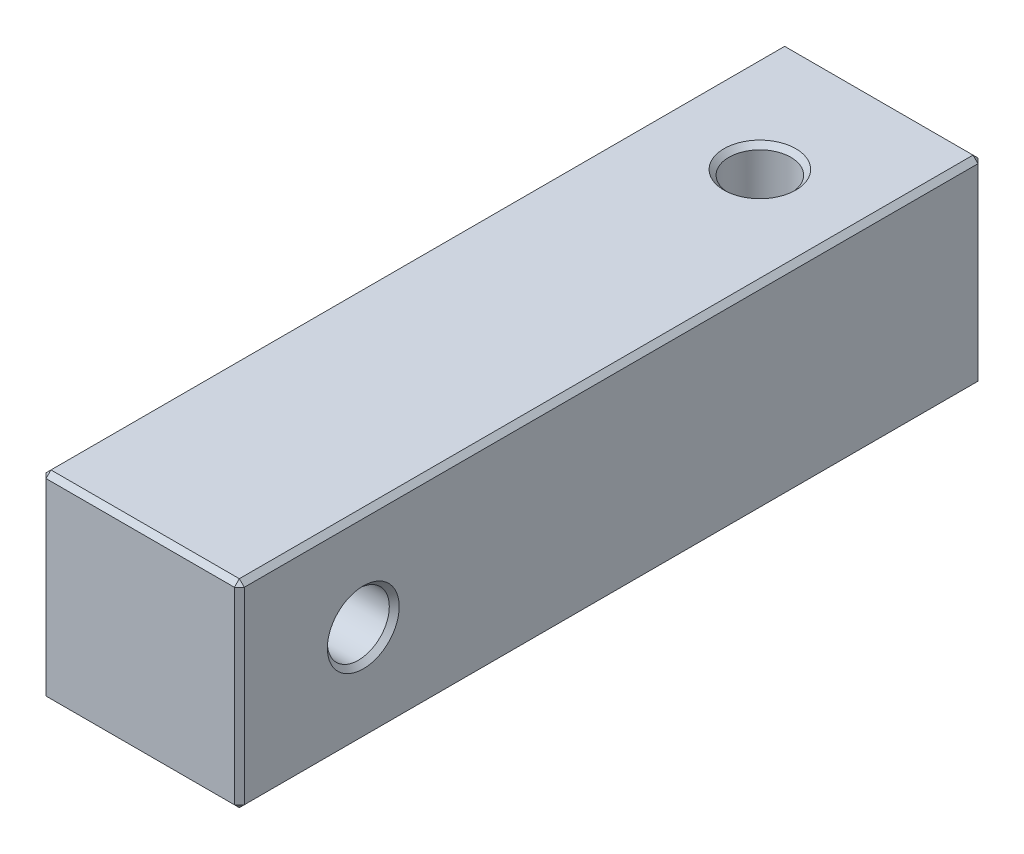
ISO-10303-21;
HEADER;
FILE_DESCRIPTION(('STEP AP214'),'2;1');
FILE_NAME('part.step','',(''),(''),'','','');
FILE_SCHEMA(('AUTOMOTIVE_DESIGN { 1 0 10303 214 1 1 1 1 }'));
ENDSEC;
DATA;
#1=APPLICATION_CONTEXT('core data for automotive mechanical design processes');
#2=APPLICATION_PROTOCOL_DEFINITION('international standard','automotive_design',2000,#1);
#3=PRODUCT_CONTEXT('',#1,'mechanical');
#4=PRODUCT('Part','Part','',(#3));
#5=PRODUCT_RELATED_PRODUCT_CATEGORY('part','',(#4));
#6=PRODUCT_DEFINITION_FORMATION('','',#4);
#7=PRODUCT_DEFINITION_CONTEXT('part definition',#1,'design');
#8=PRODUCT_DEFINITION('design','',#6,#7);
#9=PRODUCT_DEFINITION_SHAPE('','',#8);
#10=(LENGTH_UNIT() NAMED_UNIT(*) SI_UNIT(.MILLI.,.METRE.));
#11=(NAMED_UNIT(*) PLANE_ANGLE_UNIT() SI_UNIT($,.RADIAN.));
#12=(NAMED_UNIT(*) SI_UNIT($,.STERADIAN.) SOLID_ANGLE_UNIT());
#13=UNCERTAINTY_MEASURE_WITH_UNIT(LENGTH_MEASURE(1.E-05),#10,'distance_accuracy_value','');
#14=(GEOMETRIC_REPRESENTATION_CONTEXT(3) GLOBAL_UNCERTAINTY_ASSIGNED_CONTEXT((#13)) GLOBAL_UNIT_ASSIGNED_CONTEXT((#10,
#11,#12)) REPRESENTATION_CONTEXT('',''));
#15=CARTESIAN_POINT('',(0.,0.,0.));
#16=DIRECTION('',(0.,0.,1.));
#17=DIRECTION('',(1.,0.,0.));
#18=AXIS2_PLACEMENT_3D('',#15,#16,#17);
#19=CARTESIAN_POINT('',(4.,4.,15.));
#20=DIRECTION('',(-1.,0.,0.));
#21=DIRECTION('',(0.,-1.,0.));
#22=AXIS2_PLACEMENT_3D('',#19,#20,#21);
#23=PLANE('',#22);
#24=DIRECTION('',(0.,-1.,0.));
#25=VECTOR('',#24,1.);
#26=CARTESIAN_POINT('',(4.,-4.,14.8));
#27=LINE('',#26,#25);
#28=CARTESIAN_POINT('',(4.,3.8,14.8));
#29=VERTEX_POINT('',#28);
#30=CARTESIAN_POINT('',(4.,-3.8,14.8));
#31=VERTEX_POINT('',#30);
#32=EDGE_CURVE('E51',#29,#31,#27,.T.);
#33=ORIENTED_EDGE('',*,*,#32,.T.);
#34=DIRECTION('',(0.,0.,-1.));
#35=VECTOR('',#34,1.);
#36=CARTESIAN_POINT('',(4.,-3.8,15.));
#37=LINE('',#36,#35);
#38=CARTESIAN_POINT('',(4.,-3.8,-14.8));
#39=VERTEX_POINT('',#38);
#40=EDGE_CURVE('E11',#31,#39,#37,.T.);
#41=ORIENTED_EDGE('',*,*,#40,.T.);
#42=DIRECTION('',(0.,1.,0.));
#43=VECTOR('',#42,1.);
#44=CARTESIAN_POINT('',(4.,4.,-14.8));
#45=LINE('',#44,#43);
#46=CARTESIAN_POINT('',(4.,3.8,-14.8));
#47=VERTEX_POINT('',#46);
#48=EDGE_CURVE('E232',#39,#47,#45,.T.);
#49=ORIENTED_EDGE('',*,*,#48,.T.);
#50=DIRECTION('',(0.,0.,1.));
#51=VECTOR('',#50,1.);
#52=CARTESIAN_POINT('',(4.,3.8,15.));
#53=LINE('',#52,#51);
#54=EDGE_CURVE('E62',#47,#29,#53,.T.);
#55=ORIENTED_EDGE('',*,*,#54,.T.);
#56=EDGE_LOOP('',(#33,#41,#49,#55));
#57=FACE_BOUND('',#56,.T.);
#58=CARTESIAN_POINT('',(4.,0.,10.));
#59=DIRECTION('',(-1.,0.,0.));
#60=DIRECTION('',(0.,-1.,0.));
#61=AXIS2_PLACEMENT_3D('',#58,#59,#60);
#62=CIRCLE('',#61,1.45);
#63=CARTESIAN_POINT('',(4.,-1.45,10.));
#64=VERTEX_POINT('',#63);
#65=EDGE_CURVE('E229',#64,#64,#62,.T.);
#66=ORIENTED_EDGE('',*,*,#65,.T.);
#67=EDGE_LOOP('',(#66));
#68=FACE_BOUND('',#67,.T.);
#69=ADVANCED_FACE('F41',(#57,#68),#23,.F.);
#70=CARTESIAN_POINT('',(-4.,4.,15.));
#71=DIRECTION('',(0.,-1.,0.));
#72=DIRECTION('',(0.,0.,-1.));
#73=AXIS2_PLACEMENT_3D('',#70,#71,#72);
#74=PLANE('',#73);
#75=CARTESIAN_POINT('',(0.,4.,-10.));
#76=DIRECTION('',(0.,-1.,0.));
#77=DIRECTION('',(0.,0.,-1.));
#78=AXIS2_PLACEMENT_3D('',#75,#76,#77);
#79=CIRCLE('',#78,1.44999999999998);
#80=CARTESIAN_POINT('',(0.,4.,-11.45));
#81=VERTEX_POINT('',#80);
#82=EDGE_CURVE('E210',#81,#81,#79,.T.);
#83=ORIENTED_EDGE('',*,*,#82,.T.);
#84=EDGE_LOOP('',(#83));
#85=FACE_BOUND('',#84,.T.);
#86=DIRECTION('',(0.,0.,1.));
#87=VECTOR('',#86,1.);
#88=CARTESIAN_POINT('',(-3.8,4.,15.));
#89=LINE('',#88,#87);
#90=CARTESIAN_POINT('',(-3.8,4.,-14.8));
#91=VERTEX_POINT('',#90);
#92=CARTESIAN_POINT('',(-3.8,4.,14.8));
#93=VERTEX_POINT('',#92);
#94=EDGE_CURVE('E205',#91,#93,#89,.T.);
#95=ORIENTED_EDGE('',*,*,#94,.T.);
#96=DIRECTION('',(1.,0.,0.));
#97=VECTOR('',#96,1.);
#98=CARTESIAN_POINT('',(4.,4.,14.8));
#99=LINE('',#98,#97);
#100=CARTESIAN_POINT('',(3.8,4.,14.8));
#101=VERTEX_POINT('',#100);
#102=EDGE_CURVE('E207',#93,#101,#99,.T.);
#103=ORIENTED_EDGE('',*,*,#102,.T.);
#104=DIRECTION('',(0.,0.,-1.));
#105=VECTOR('',#104,1.);
#106=CARTESIAN_POINT('',(3.8,4.,15.));
#107=LINE('',#106,#105);
#108=CARTESIAN_POINT('',(3.8,4.,-14.8));
#109=VERTEX_POINT('',#108);
#110=EDGE_CURVE('E201',#101,#109,#107,.T.);
#111=ORIENTED_EDGE('',*,*,#110,.T.);
#112=DIRECTION('',(-1.,0.,0.));
#113=VECTOR('',#112,1.);
#114=CARTESIAN_POINT('',(-4.,4.,-14.8));
#115=LINE('',#114,#113);
#116=EDGE_CURVE('E203',#109,#91,#115,.T.);
#117=ORIENTED_EDGE('',*,*,#116,.T.);
#118=EDGE_LOOP('',(#95,#103,#111,#117));
#119=FACE_BOUND('',#118,.T.);
#120=ADVANCED_FACE('F332',(#85,#119),#74,.F.);
#121=CARTESIAN_POINT('',(-4.,4.,15.));
#122=DIRECTION('',(1.,0.,0.));
#123=DIRECTION('',(0.,1.,0.));
#124=AXIS2_PLACEMENT_3D('',#121,#122,#123);
#125=PLANE('',#124);
#126=CARTESIAN_POINT('',(-4.,0.,10.));
#127=DIRECTION('',(1.,0.,0.));
#128=DIRECTION('',(0.,1.,0.));
#129=AXIS2_PLACEMENT_3D('',#126,#127,#128);
#130=CIRCLE('',#129,1.45);
#131=CARTESIAN_POINT('',(-4.,1.45,10.));
#132=VERTEX_POINT('',#131);
#133=EDGE_CURVE('E192',#132,#132,#130,.T.);
#134=ORIENTED_EDGE('',*,*,#133,.T.);
#135=EDGE_LOOP('',(#134));
#136=FACE_BOUND('',#135,.T.);
#137=DIRECTION('',(0.,0.,1.));
#138=VECTOR('',#137,1.);
#139=CARTESIAN_POINT('',(-4.,-3.8,15.));
#140=LINE('',#139,#138);
#141=CARTESIAN_POINT('',(-4.,-3.8,-14.8));
#142=VERTEX_POINT('',#141);
#143=CARTESIAN_POINT('',(-4.,-3.8,14.8));
#144=VERTEX_POINT('',#143);
#145=EDGE_CURVE('E187',#142,#144,#140,.T.);
#146=ORIENTED_EDGE('',*,*,#145,.T.);
#147=DIRECTION('',(0.,1.,0.));
#148=VECTOR('',#147,1.);
#149=CARTESIAN_POINT('',(-4.,4.,14.8));
#150=LINE('',#149,#148);
#151=CARTESIAN_POINT('',(-4.,3.8,14.8));
#152=VERTEX_POINT('',#151);
#153=EDGE_CURVE('E189',#144,#152,#150,.T.);
#154=ORIENTED_EDGE('',*,*,#153,.T.);
#155=DIRECTION('',(0.,0.,-1.));
#156=VECTOR('',#155,1.);
#157=CARTESIAN_POINT('',(-4.,3.8,15.));
#158=LINE('',#157,#156);
#159=CARTESIAN_POINT('',(-4.,3.8,-14.8));
#160=VERTEX_POINT('',#159);
#161=EDGE_CURVE('E183',#152,#160,#158,.T.);
#162=ORIENTED_EDGE('',*,*,#161,.T.);
#163=DIRECTION('',(0.,-1.,0.));
#164=VECTOR('',#163,1.);
#165=CARTESIAN_POINT('',(-4.,4.,-14.8));
#166=LINE('',#165,#164);
#167=EDGE_CURVE('E185',#160,#142,#166,.T.);
#168=ORIENTED_EDGE('',*,*,#167,.T.);
#169=EDGE_LOOP('',(#146,#154,#162,#168));
#170=FACE_BOUND('',#169,.T.);
#171=ADVANCED_FACE('F360',(#136,#170),#125,.F.);
#172=CARTESIAN_POINT('',(-4.,-4.,15.));
#173=DIRECTION('',(0.,1.,0.));
#174=DIRECTION('',(0.,0.,1.));
#175=AXIS2_PLACEMENT_3D('',#172,#173,#174);
#176=PLANE('',#175);
#177=CARTESIAN_POINT('',(0.,-4.,-10.));
#178=DIRECTION('',(0.,1.,0.));
#179=DIRECTION('',(0.,0.,1.));
#180=AXIS2_PLACEMENT_3D('',#177,#178,#179);
#181=CIRCLE('',#180,1.45);
#182=CARTESIAN_POINT('',(0.,-4.,-8.55));
#183=VERTEX_POINT('',#182);
#184=EDGE_CURVE('E174',#183,#183,#181,.T.);
#185=ORIENTED_EDGE('',*,*,#184,.T.);
#186=EDGE_LOOP('',(#185));
#187=FACE_BOUND('',#186,.T.);
#188=DIRECTION('',(-1.,0.,0.));
#189=VECTOR('',#188,1.);
#190=CARTESIAN_POINT('',(-4.,-4.,14.8));
#191=LINE('',#190,#189);
#192=CARTESIAN_POINT('',(3.8,-4.,14.8));
#193=VERTEX_POINT('',#192);
#194=CARTESIAN_POINT('',(-3.8,-4.,14.8));
#195=VERTEX_POINT('',#194);
#196=EDGE_CURVE('E142',#193,#195,#191,.T.);
#197=ORIENTED_EDGE('',*,*,#196,.T.);
#198=DIRECTION('',(0.,0.,-1.));
#199=VECTOR('',#198,1.);
#200=CARTESIAN_POINT('',(-3.8,-4.,15.));
#201=LINE('',#200,#199);
#202=CARTESIAN_POINT('',(-3.8,-4.,-14.8));
#203=VERTEX_POINT('',#202);
#204=EDGE_CURVE('E138',#195,#203,#201,.T.);
#205=ORIENTED_EDGE('',*,*,#204,.T.);
#206=DIRECTION('',(1.,0.,0.));
#207=VECTOR('',#206,1.);
#208=CARTESIAN_POINT('',(-4.,-4.,-14.8));
#209=LINE('',#208,#207);
#210=CARTESIAN_POINT('',(3.8,-4.,-14.8));
#211=VERTEX_POINT('',#210);
#212=EDGE_CURVE('E130',#203,#211,#209,.T.);
#213=ORIENTED_EDGE('',*,*,#212,.T.);
#214=DIRECTION('',(0.,0.,1.));
#215=VECTOR('',#214,1.);
#216=CARTESIAN_POINT('',(3.8,-4.,15.));
#217=LINE('',#216,#215);
#218=EDGE_CURVE('E135',#211,#193,#217,.T.);
#219=ORIENTED_EDGE('',*,*,#218,.T.);
#220=EDGE_LOOP('',(#197,#205,#213,#219));
#221=FACE_BOUND('',#220,.T.);
#222=ADVANCED_FACE('F133',(#187,#221),#176,.F.);
#223=CARTESIAN_POINT('',(0.,0.,15.));
#224=DIRECTION('',(0.,0.,1.));
#225=DIRECTION('',(1.,0.,0.));
#226=AXIS2_PLACEMENT_3D('',#223,#224,#225);
#227=PLANE('',#226);
#228=DIRECTION('',(0.,-1.,0.));
#229=VECTOR('',#228,1.);
#230=CARTESIAN_POINT('',(-3.8,-4.,15.));
#231=LINE('',#230,#229);
#232=CARTESIAN_POINT('',(-3.8,3.8,15.));
#233=VERTEX_POINT('',#232);
#234=CARTESIAN_POINT('',(-3.8,-3.8,15.));
#235=VERTEX_POINT('',#234);
#236=EDGE_CURVE('E217',#233,#235,#231,.T.);
#237=ORIENTED_EDGE('',*,*,#236,.T.);
#238=DIRECTION('',(1.,0.,0.));
#239=VECTOR('',#238,1.);
#240=CARTESIAN_POINT('',(4.,-3.8,15.));
#241=LINE('',#240,#239);
#242=CARTESIAN_POINT('',(3.8,-3.8,15.));
#243=VERTEX_POINT('',#242);
#244=EDGE_CURVE('E219',#235,#243,#241,.T.);
#245=ORIENTED_EDGE('',*,*,#244,.T.);
#246=DIRECTION('',(0.,1.,0.));
#247=VECTOR('',#246,1.);
#248=CARTESIAN_POINT('',(3.8,4.,15.));
#249=LINE('',#248,#247);
#250=CARTESIAN_POINT('',(3.8,3.8,15.));
#251=VERTEX_POINT('',#250);
#252=EDGE_CURVE('E213',#243,#251,#249,.T.);
#253=ORIENTED_EDGE('',*,*,#252,.T.);
#254=DIRECTION('',(-1.,0.,0.));
#255=VECTOR('',#254,1.);
#256=CARTESIAN_POINT('',(-4.,3.8,15.));
#257=LINE('',#256,#255);
#258=EDGE_CURVE('E215',#251,#233,#257,.T.);
#259=ORIENTED_EDGE('',*,*,#258,.T.);
#260=EDGE_LOOP('',(#237,#245,#253,#259));
#261=FACE_BOUND('',#260,.T.);
#262=ADVANCED_FACE('F352',(#261),#227,.T.);
#263=CARTESIAN_POINT('',(0.,0.,-15.));
#264=DIRECTION('',(0.,0.,1.));
#265=DIRECTION('',(1.,0.,0.));
#266=AXIS2_PLACEMENT_3D('',#263,#264,#265);
#267=PLANE('',#266);
#268=DIRECTION('',(0.,-1.,0.));
#269=VECTOR('',#268,1.);
#270=CARTESIAN_POINT('',(3.8,0.,-15.));
#271=LINE('',#270,#269);
#272=CARTESIAN_POINT('',(3.8,3.8,-15.));
#273=VERTEX_POINT('',#272);
#274=CARTESIAN_POINT('',(3.8,-3.8,-15.));
#275=VERTEX_POINT('',#274);
#276=EDGE_CURVE('E222',#273,#275,#271,.T.);
#277=ORIENTED_EDGE('',*,*,#276,.T.);
#278=DIRECTION('',(-1.,0.,0.));
#279=VECTOR('',#278,1.);
#280=CARTESIAN_POINT('',(0.,-3.8,-15.));
#281=LINE('',#280,#279);
#282=CARTESIAN_POINT('',(-3.8,-3.8,-15.));
#283=VERTEX_POINT('',#282);
#284=EDGE_CURVE('E150',#275,#283,#281,.T.);
#285=ORIENTED_EDGE('',*,*,#284,.T.);
#286=DIRECTION('',(0.,1.,0.));
#287=VECTOR('',#286,1.);
#288=CARTESIAN_POINT('',(-3.8,0.,-15.));
#289=LINE('',#288,#287);
#290=CARTESIAN_POINT('',(-3.8,3.8,-15.));
#291=VERTEX_POINT('',#290);
#292=EDGE_CURVE('E226',#283,#291,#289,.T.);
#293=ORIENTED_EDGE('',*,*,#292,.T.);
#294=DIRECTION('',(1.,0.,0.));
#295=VECTOR('',#294,1.);
#296=CARTESIAN_POINT('',(0.,3.8,-15.));
#297=LINE('',#296,#295);
#298=EDGE_CURVE('E224',#291,#273,#297,.T.);
#299=ORIENTED_EDGE('',*,*,#298,.T.);
#300=EDGE_LOOP('',(#277,#285,#293,#299));
#301=FACE_BOUND('',#300,.T.);
#302=ADVANCED_FACE('F327',(#301),#267,.F.);
#303=CARTESIAN_POINT('',(4.,0.,10.));
#304=DIRECTION('',(1.,0.,0.));
#305=DIRECTION('',(0.,0.,-1.));
#306=AXIS2_PLACEMENT_3D('',#303,#304,#305);
#307=CYLINDRICAL_SURFACE('',#306,1.25);
#308=CARTESIAN_POINT('',(-3.79999999999999,0.,10.));
#309=DIRECTION('',(1.,0.,0.));
#310=DIRECTION('',(0.,0.,-1.));
#311=AXIS2_PLACEMENT_3D('',#308,#309,#310);
#312=CIRCLE('',#311,1.25);
#313=CARTESIAN_POINT('',(-3.79999999999999,0.,8.75));
#314=VERTEX_POINT('',#313);
#315=EDGE_CURVE('E198',#314,#314,#312,.F.);
#316=ORIENTED_EDGE('',*,*,#315,.T.);
#317=EDGE_LOOP('',(#316));
#318=FACE_BOUND('',#317,.T.);
#319=CARTESIAN_POINT('',(3.80000000000001,0.,10.));
#320=DIRECTION('',(-1.,0.,0.));
#321=DIRECTION('',(0.,0.,1.));
#322=AXIS2_PLACEMENT_3D('',#319,#320,#321);
#323=CIRCLE('',#322,1.25);
#324=CARTESIAN_POINT('',(3.80000000000001,0.,11.25));
#325=VERTEX_POINT('',#324);
#326=EDGE_CURVE('E195',#325,#325,#323,.F.);
#327=ORIENTED_EDGE('',*,*,#326,.T.);
#328=EDGE_LOOP('',(#327));
#329=FACE_BOUND('',#328,.T.);
#330=ADVANCED_FACE('F340',(#318,#329),#307,.F.);
#331=CARTESIAN_POINT('',(0.,4.,-10.));
#332=DIRECTION('',(0.,1.,0.));
#333=DIRECTION('',(0.,0.,1.));
#334=AXIS2_PLACEMENT_3D('',#331,#332,#333);
#335=CYLINDRICAL_SURFACE('',#334,1.24999999999999);
#336=CARTESIAN_POINT('',(0.,-3.79999999999999,-10.));
#337=DIRECTION('',(0.,1.,0.));
#338=DIRECTION('',(0.,0.,1.));
#339=AXIS2_PLACEMENT_3D('',#336,#337,#338);
#340=CIRCLE('',#339,1.24999999999999);
#341=CARTESIAN_POINT('',(0.,-3.79999999999999,-8.75000000000001));
#342=VERTEX_POINT('',#341);
#343=EDGE_CURVE('E180',#342,#342,#340,.F.);
#344=ORIENTED_EDGE('',*,*,#343,.T.);
#345=EDGE_LOOP('',(#344));
#346=FACE_BOUND('',#345,.T.);
#347=CARTESIAN_POINT('',(0.,3.80000000000001,-10.));
#348=DIRECTION('',(0.,-1.,0.));
#349=DIRECTION('',(0.,0.,-1.));
#350=AXIS2_PLACEMENT_3D('',#347,#348,#349);
#351=CIRCLE('',#350,1.24999999999999);
#352=CARTESIAN_POINT('',(0.,3.80000000000001,-11.25));
#353=VERTEX_POINT('',#352);
#354=EDGE_CURVE('E177',#353,#353,#351,.F.);
#355=ORIENTED_EDGE('',*,*,#354,.T.);
#356=EDGE_LOOP('',(#355));
#357=FACE_BOUND('',#356,.T.);
#358=ADVANCED_FACE('F342',(#346,#357),#335,.F.);
#359=CARTESIAN_POINT('',(0.,-4.,-10.));
#360=DIRECTION('',(0.,-1.,0.));
#361=DIRECTION('',(0.,0.,-1.));
#362=AXIS2_PLACEMENT_3D('',#359,#360,#361);
#363=CONICAL_SURFACE('',#362,1.45,0.785398163397445);
#364=ORIENTED_EDGE('',*,*,#343,.F.);
#365=EDGE_LOOP('',(#364));
#366=FACE_BOUND('',#365,.T.);
#367=ORIENTED_EDGE('',*,*,#184,.F.);
#368=EDGE_LOOP('',(#367));
#369=FACE_BOUND('',#368,.T.);
#370=ADVANCED_FACE('F349',(#366,#369),#363,.F.);
#371=CARTESIAN_POINT('',(-4.,0.,10.));
#372=DIRECTION('',(-1.,0.,0.));
#373=DIRECTION('',(0.,0.,1.));
#374=AXIS2_PLACEMENT_3D('',#371,#372,#373);
#375=CONICAL_SURFACE('',#374,1.45,0.78539816339745);
#376=ORIENTED_EDGE('',*,*,#315,.F.);
#377=EDGE_LOOP('',(#376));
#378=FACE_BOUND('',#377,.T.);
#379=ORIENTED_EDGE('',*,*,#133,.F.);
#380=EDGE_LOOP('',(#379));
#381=FACE_BOUND('',#380,.T.);
#382=ADVANCED_FACE('F374',(#378,#381),#375,.F.);
#383=CARTESIAN_POINT('',(0.,3.80000000000001,-10.));
#384=DIRECTION('',(0.,1.,0.));
#385=DIRECTION('',(0.,0.,1.));
#386=AXIS2_PLACEMENT_3D('',#383,#384,#385);
#387=CONICAL_SURFACE('',#386,1.24999999999999,0.785398163397449);
#388=ORIENTED_EDGE('',*,*,#82,.F.);
#389=EDGE_LOOP('',(#388));
#390=FACE_BOUND('',#389,.T.);
#391=ORIENTED_EDGE('',*,*,#354,.F.);
#392=EDGE_LOOP('',(#391));
#393=FACE_BOUND('',#392,.T.);
#394=ADVANCED_FACE('F381',(#390,#393),#387,.F.);
#395=CARTESIAN_POINT('',(-4.,4.,-14.8));
#396=DIRECTION('',(0.,-0.707106781186548,0.707106781186548));
#397=DIRECTION('',(-1.,0.,0.));
#398=AXIS2_PLACEMENT_3D('',#395,#396,#397);
#399=PLANE('',#398);
#400=DIRECTION('',(0.,0.707106781186547,0.707106781186547));
#401=VECTOR('',#400,1.);
#402=CARTESIAN_POINT('',(-3.8,3.8,-15.));
#403=LINE('',#402,#401);
#404=EDGE_CURVE('E46',#91,#291,#403,.F.);
#405=ORIENTED_EDGE('',*,*,#404,.F.);
#406=ORIENTED_EDGE('',*,*,#116,.F.);
#407=DIRECTION('',(0.,-0.707106781186547,-0.707106781186547));
#408=VECTOR('',#407,1.);
#409=CARTESIAN_POINT('',(3.8,3.8,-15.));
#410=LINE('',#409,#408);
#411=EDGE_CURVE('E170',#273,#109,#410,.F.);
#412=ORIENTED_EDGE('',*,*,#411,.F.);
#413=ORIENTED_EDGE('',*,*,#298,.F.);
#414=EDGE_LOOP('',(#405,#406,#412,#413));
#415=FACE_BOUND('',#414,.T.);
#416=ADVANCED_FACE('F388',(#415),#399,.F.);
#417=CARTESIAN_POINT('',(-3.8,3.8,-15.));
#418=DIRECTION('',(-0.577350269189626,0.577350269189626,-0.577350269189626));
#419=DIRECTION('',(-0.707106781186548,0.,0.707106781186548));
#420=AXIS2_PLACEMENT_3D('',#417,#418,#419);
#421=PLANE('',#420);
#422=DIRECTION('',(-0.707106781186547,-0.707106781186547,0.));
#423=VECTOR('',#422,1.);
#424=CARTESIAN_POINT('',(-3.9,3.9,-14.8));
#425=LINE('',#424,#423);
#426=EDGE_CURVE('E277',#91,#160,#425,.T.);
#427=ORIENTED_EDGE('',*,*,#426,.F.);
#428=ORIENTED_EDGE('',*,*,#404,.T.);
#429=DIRECTION('',(0.707106781186548,0.,-0.707106781186548));
#430=VECTOR('',#429,1.);
#431=CARTESIAN_POINT('',(-3.8,3.8,-15.));
#432=LINE('',#431,#430);
#433=EDGE_CURVE('E280',#160,#291,#432,.T.);
#434=ORIENTED_EDGE('',*,*,#433,.F.);
#435=EDGE_LOOP('',(#427,#428,#434));
#436=FACE_BOUND('',#435,.T.);
#437=ADVANCED_FACE('F489',(#436),#421,.T.);
#438=CARTESIAN_POINT('',(3.8,3.8,-15.));
#439=DIRECTION('',(0.577350269189626,0.577350269189626,-0.577350269189626));
#440=DIRECTION('',(-0.707106781186548,0.,-0.707106781186548));
#441=AXIS2_PLACEMENT_3D('',#438,#439,#440);
#442=PLANE('',#441);
#443=DIRECTION('',(0.707106781186548,0.,0.707106781186548));
#444=VECTOR('',#443,1.);
#445=CARTESIAN_POINT('',(3.8,3.8,-15.));
#446=LINE('',#445,#444);
#447=EDGE_CURVE('E271',#273,#47,#446,.T.);
#448=ORIENTED_EDGE('',*,*,#447,.F.);
#449=ORIENTED_EDGE('',*,*,#411,.T.);
#450=DIRECTION('',(-0.707106781186547,0.707106781186547,0.));
#451=VECTOR('',#450,1.);
#452=CARTESIAN_POINT('',(3.9,3.9,-14.8));
#453=LINE('',#452,#451);
#454=EDGE_CURVE('E274',#47,#109,#453,.T.);
#455=ORIENTED_EDGE('',*,*,#454,.F.);
#456=EDGE_LOOP('',(#448,#449,#455));
#457=FACE_BOUND('',#456,.T.);
#458=ADVANCED_FACE('F287',(#457),#442,.T.);
#459=CARTESIAN_POINT('',(-4.,4.,-14.8));
#460=DIRECTION('',(0.707106781186548,0.,0.707106781186548));
#461=DIRECTION('',(0.,-1.,0.));
#462=AXIS2_PLACEMENT_3D('',#459,#460,#461);
#463=PLANE('',#462);
#464=ORIENTED_EDGE('',*,*,#433,.T.);
#465=ORIENTED_EDGE('',*,*,#292,.F.);
#466=DIRECTION('',(-0.707106781186547,0.,0.707106781186547));
#467=VECTOR('',#466,1.);
#468=CARTESIAN_POINT('',(-3.8,-3.8,-15.));
#469=LINE('',#468,#467);
#470=EDGE_CURVE('E267',#142,#283,#469,.F.);
#471=ORIENTED_EDGE('',*,*,#470,.F.);
#472=ORIENTED_EDGE('',*,*,#167,.F.);
#473=EDGE_LOOP('',(#464,#465,#471,#472));
#474=FACE_BOUND('',#473,.T.);
#475=ADVANCED_FACE('F323',(#474),#463,.F.);
#476=CARTESIAN_POINT('',(-4.,3.8,15.));
#477=DIRECTION('',(0.707106781186548,-0.707106781186548,0.));
#478=DIRECTION('',(0.,0.,-1.));
#479=AXIS2_PLACEMENT_3D('',#476,#477,#478);
#480=PLANE('',#479);
#481=ORIENTED_EDGE('',*,*,#426,.T.);
#482=ORIENTED_EDGE('',*,*,#161,.F.);
#483=DIRECTION('',(0.707106781186547,0.707106781186547,0.));
#484=VECTOR('',#483,1.);
#485=CARTESIAN_POINT('',(-4.,3.8,14.8));
#486=LINE('',#485,#484);
#487=EDGE_CURVE('E264',#93,#152,#486,.F.);
#488=ORIENTED_EDGE('',*,*,#487,.F.);
#489=ORIENTED_EDGE('',*,*,#94,.F.);
#490=EDGE_LOOP('',(#481,#482,#488,#489));
#491=FACE_BOUND('',#490,.T.);
#492=ADVANCED_FACE('F471',(#491),#480,.F.);
#493=CARTESIAN_POINT('',(0.,3.8,15.));
#494=DIRECTION('',(0.,0.707106781186548,0.707106781186548));
#495=DIRECTION('',(1.,0.,0.));
#496=AXIS2_PLACEMENT_3D('',#493,#494,#495);
#497=PLANE('',#496);
#498=DIRECTION('',(0.,-0.707106781186547,0.707106781186547));
#499=VECTOR('',#498,1.);
#500=CARTESIAN_POINT('',(3.8,4.,14.8));
#501=LINE('',#500,#499);
#502=EDGE_CURVE('E258',#101,#251,#501,.T.);
#503=ORIENTED_EDGE('',*,*,#502,.F.);
#504=ORIENTED_EDGE('',*,*,#102,.F.);
#505=DIRECTION('',(0.,0.707106781186547,-0.707106781186547));
#506=VECTOR('',#505,1.);
#507=CARTESIAN_POINT('',(-3.8,3.9,14.9));
#508=LINE('',#507,#506);
#509=EDGE_CURVE('E261',#233,#93,#508,.T.);
#510=ORIENTED_EDGE('',*,*,#509,.F.);
#511=ORIENTED_EDGE('',*,*,#258,.F.);
#512=EDGE_LOOP('',(#503,#504,#510,#511));
#513=FACE_BOUND('',#512,.T.);
#514=ADVANCED_FACE('F465',(#513),#497,.T.);
#515=CARTESIAN_POINT('',(3.8,4.,15.));
#516=DIRECTION('',(-0.707106781186548,-0.707106781186548,0.));
#517=DIRECTION('',(0.,0.,-1.));
#518=AXIS2_PLACEMENT_3D('',#515,#516,#517);
#519=PLANE('',#518);
#520=ORIENTED_EDGE('',*,*,#454,.T.);
#521=ORIENTED_EDGE('',*,*,#110,.F.);
#522=DIRECTION('',(0.707106781186547,-0.707106781186547,0.));
#523=VECTOR('',#522,1.);
#524=CARTESIAN_POINT('',(3.8,4.,14.8));
#525=LINE('',#524,#523);
#526=EDGE_CURVE('E256',#29,#101,#525,.F.);
#527=ORIENTED_EDGE('',*,*,#526,.F.);
#528=ORIENTED_EDGE('',*,*,#54,.F.);
#529=EDGE_LOOP('',(#520,#521,#527,#528));
#530=FACE_BOUND('',#529,.T.);
#531=ADVANCED_FACE('F294',(#530),#519,.F.);
#532=CARTESIAN_POINT('',(4.,4.,-14.8));
#533=DIRECTION('',(-0.707106781186548,0.,0.707106781186548));
#534=DIRECTION('',(0.,1.,0.));
#535=AXIS2_PLACEMENT_3D('',#532,#533,#534);
#536=PLANE('',#535);
#537=ORIENTED_EDGE('',*,*,#447,.T.);
#538=ORIENTED_EDGE('',*,*,#48,.F.);
#539=DIRECTION('',(-0.707106781186547,0.,-0.707106781186547));
#540=VECTOR('',#539,1.);
#541=CARTESIAN_POINT('',(3.9,-3.8,-14.9));
#542=LINE('',#541,#540);
#543=EDGE_CURVE('E154',#275,#39,#542,.F.);
#544=ORIENTED_EDGE('',*,*,#543,.F.);
#545=ORIENTED_EDGE('',*,*,#276,.F.);
#546=EDGE_LOOP('',(#537,#538,#544,#545));
#547=FACE_BOUND('',#546,.T.);
#548=ADVANCED_FACE('F329',(#547),#536,.F.);
#549=CARTESIAN_POINT('',(-4.,-4.,-14.8));
#550=DIRECTION('',(0.,0.707106781186548,0.707106781186548));
#551=DIRECTION('',(1.,0.,0.));
#552=AXIS2_PLACEMENT_3D('',#549,#550,#551);
#553=PLANE('',#552);
#554=DIRECTION('',(0.,0.707106781186547,-0.707106781186547));
#555=VECTOR('',#554,1.);
#556=CARTESIAN_POINT('',(-3.8,-3.8,-15.));
#557=LINE('',#556,#555);
#558=EDGE_CURVE('E269',#283,#203,#557,.F.);
#559=ORIENTED_EDGE('',*,*,#558,.F.);
#560=ORIENTED_EDGE('',*,*,#284,.F.);
#561=DIRECTION('',(0.,-0.707106781186547,0.707106781186547));
#562=VECTOR('',#561,1.);
#563=CARTESIAN_POINT('',(3.8,-4.,-14.8));
#564=LINE('',#563,#562);
#565=EDGE_CURVE('E146',#211,#275,#564,.F.);
#566=ORIENTED_EDGE('',*,*,#565,.F.);
#567=ORIENTED_EDGE('',*,*,#212,.F.);
#568=EDGE_LOOP('',(#559,#560,#566,#567));
#569=FACE_BOUND('',#568,.T.);
#570=ADVANCED_FACE('F148',(#569),#553,.F.);
#571=CARTESIAN_POINT('',(-3.8,-3.8,-15.));
#572=DIRECTION('',(-0.577350269189626,-0.577350269189626,-0.577350269189626));
#573=DIRECTION('',(-0.707106781186548,0.,0.707106781186548));
#574=AXIS2_PLACEMENT_3D('',#571,#572,#573);
#575=PLANE('',#574);
#576=ORIENTED_EDGE('',*,*,#470,.T.);
#577=ORIENTED_EDGE('',*,*,#558,.T.);
#578=DIRECTION('',(0.707106781186547,-0.707106781186547,0.));
#579=VECTOR('',#578,1.);
#580=CARTESIAN_POINT('',(-3.9,-3.9,-14.8));
#581=LINE('',#580,#579);
#582=EDGE_CURVE('E155',#142,#203,#581,.T.);
#583=ORIENTED_EDGE('',*,*,#582,.F.);
#584=EDGE_LOOP('',(#576,#577,#583));
#585=FACE_BOUND('',#584,.T.);
#586=ADVANCED_FACE('F319',(#585),#575,.T.);
#587=CARTESIAN_POINT('',(-4.,3.8,14.8));
#588=DIRECTION('',(-0.577350269189626,0.577350269189626,0.577350269189626));
#589=DIRECTION('',(0.707106781186548,0.,0.707106781186548));
#590=AXIS2_PLACEMENT_3D('',#587,#588,#589);
#591=PLANE('',#590);
#592=ORIENTED_EDGE('',*,*,#509,.T.);
#593=ORIENTED_EDGE('',*,*,#487,.T.);
#594=DIRECTION('',(0.707106781186548,0.,0.707106781186548));
#595=VECTOR('',#594,1.);
#596=CARTESIAN_POINT('',(-4.,3.8,14.8));
#597=LINE('',#596,#595);
#598=EDGE_CURVE('E251',#233,#152,#597,.F.);
#599=ORIENTED_EDGE('',*,*,#598,.F.);
#600=EDGE_LOOP('',(#592,#593,#599));
#601=FACE_BOUND('',#600,.T.);
#602=ADVANCED_FACE('F438',(#601),#591,.T.);
#603=CARTESIAN_POINT('',(3.8,4.,14.8));
#604=DIRECTION('',(0.577350269189626,0.577350269189626,0.577350269189626));
#605=DIRECTION('',(0.707106781186548,0.,-0.707106781186548));
#606=AXIS2_PLACEMENT_3D('',#603,#604,#605);
#607=PLANE('',#606);
#608=ORIENTED_EDGE('',*,*,#526,.T.);
#609=ORIENTED_EDGE('',*,*,#502,.T.);
#610=DIRECTION('',(0.707106781186548,0.,-0.707106781186548));
#611=VECTOR('',#610,1.);
#612=CARTESIAN_POINT('',(3.9,3.8,14.9));
#613=LINE('',#612,#611);
#614=EDGE_CURVE('E161',#29,#251,#613,.F.);
#615=ORIENTED_EDGE('',*,*,#614,.F.);
#616=EDGE_LOOP('',(#608,#609,#615));
#617=FACE_BOUND('',#616,.T.);
#618=ADVANCED_FACE('F298',(#617),#607,.T.);
#619=CARTESIAN_POINT('',(3.8,-4.,-14.8));
#620=DIRECTION('',(0.577350269189626,-0.577350269189626,-0.577350269189626));
#621=DIRECTION('',(-0.707106781186548,0.,-0.707106781186548));
#622=AXIS2_PLACEMENT_3D('',#619,#620,#621);
#623=PLANE('',#622);
#624=ORIENTED_EDGE('',*,*,#565,.T.);
#625=ORIENTED_EDGE('',*,*,#543,.T.);
#626=DIRECTION('',(0.707106781186547,0.707106781186547,0.));
#627=VECTOR('',#626,1.);
#628=CARTESIAN_POINT('',(3.8,-4.,-14.8));
#629=LINE('',#628,#627);
#630=EDGE_CURVE('E157',#211,#39,#629,.T.);
#631=ORIENTED_EDGE('',*,*,#630,.F.);
#632=EDGE_LOOP('',(#624,#625,#631));
#633=FACE_BOUND('',#632,.T.);
#634=ADVANCED_FACE('F158',(#633),#623,.T.);
#635=CARTESIAN_POINT('',(-3.8,-4.,15.));
#636=DIRECTION('',(0.707106781186548,0.707106781186548,0.));
#637=DIRECTION('',(0.,0.,-1.));
#638=AXIS2_PLACEMENT_3D('',#635,#636,#637);
#639=PLANE('',#638);
#640=ORIENTED_EDGE('',*,*,#582,.T.);
#641=ORIENTED_EDGE('',*,*,#204,.F.);
#642=DIRECTION('',(-0.707106781186547,0.707106781186547,0.));
#643=VECTOR('',#642,1.);
#644=CARTESIAN_POINT('',(-3.8,-4.,14.8));
#645=LINE('',#644,#643);
#646=EDGE_CURVE('E162',#144,#195,#645,.F.);
#647=ORIENTED_EDGE('',*,*,#646,.F.);
#648=ORIENTED_EDGE('',*,*,#145,.F.);
#649=EDGE_LOOP('',(#640,#641,#647,#648));
#650=FACE_BOUND('',#649,.T.);
#651=ADVANCED_FACE('F316',(#650),#639,.F.);
#652=CARTESIAN_POINT('',(-3.8,0.,15.));
#653=DIRECTION('',(-0.707106781186548,0.,0.707106781186548));
#654=DIRECTION('',(0.,1.,0.));
#655=AXIS2_PLACEMENT_3D('',#652,#653,#654);
#656=PLANE('',#655);
#657=ORIENTED_EDGE('',*,*,#598,.T.);
#658=ORIENTED_EDGE('',*,*,#153,.F.);
#659=DIRECTION('',(-0.707106781186547,0.,-0.707106781186547));
#660=VECTOR('',#659,1.);
#661=CARTESIAN_POINT('',(-3.9,-3.8,14.9));
#662=LINE('',#661,#660);
#663=EDGE_CURVE('E244',#235,#144,#662,.T.);
#664=ORIENTED_EDGE('',*,*,#663,.F.);
#665=ORIENTED_EDGE('',*,*,#236,.F.);
#666=EDGE_LOOP('',(#657,#658,#664,#665));
#667=FACE_BOUND('',#666,.T.);
#668=ADVANCED_FACE('F416',(#667),#656,.T.);
#669=CARTESIAN_POINT('',(3.8,0.,15.));
#670=DIRECTION('',(0.707106781186548,0.,0.707106781186548));
#671=DIRECTION('',(0.,-1.,0.));
#672=AXIS2_PLACEMENT_3D('',#669,#670,#671);
#673=PLANE('',#672);
#674=ORIENTED_EDGE('',*,*,#614,.T.);
#675=ORIENTED_EDGE('',*,*,#252,.F.);
#676=DIRECTION('',(-0.707106781186547,0.,0.707106781186547));
#677=VECTOR('',#676,1.);
#678=CARTESIAN_POINT('',(3.8,-3.8,15.));
#679=LINE('',#678,#677);
#680=EDGE_CURVE('E241',#31,#243,#679,.T.);
#681=ORIENTED_EDGE('',*,*,#680,.F.);
#682=ORIENTED_EDGE('',*,*,#32,.F.);
#683=EDGE_LOOP('',(#674,#675,#681,#682));
#684=FACE_BOUND('',#683,.T.);
#685=ADVANCED_FACE('F302',(#684),#673,.T.);
#686=CARTESIAN_POINT('',(4.,-3.8,15.));
#687=DIRECTION('',(-0.707106781186548,0.707106781186548,0.));
#688=DIRECTION('',(0.,0.,-1.));
#689=AXIS2_PLACEMENT_3D('',#686,#687,#688);
#690=PLANE('',#689);
#691=ORIENTED_EDGE('',*,*,#630,.T.);
#692=ORIENTED_EDGE('',*,*,#40,.F.);
#693=DIRECTION('',(-0.707106781186547,-0.707106781186547,0.));
#694=VECTOR('',#693,1.);
#695=CARTESIAN_POINT('',(3.9,-3.9,14.8));
#696=LINE('',#695,#694);
#697=EDGE_CURVE('E166',#193,#31,#696,.F.);
#698=ORIENTED_EDGE('',*,*,#697,.F.);
#699=ORIENTED_EDGE('',*,*,#218,.F.);
#700=EDGE_LOOP('',(#691,#692,#698,#699));
#701=FACE_BOUND('',#700,.T.);
#702=ADVANCED_FACE('F164',(#701),#690,.F.);
#703=CARTESIAN_POINT('',(-3.8,-4.,14.8));
#704=DIRECTION('',(-0.577350269189626,-0.577350269189626,0.577350269189626));
#705=DIRECTION('',(0.707106781186548,0.,0.707106781186548));
#706=AXIS2_PLACEMENT_3D('',#703,#704,#705);
#707=PLANE('',#706);
#708=ORIENTED_EDGE('',*,*,#663,.T.);
#709=ORIENTED_EDGE('',*,*,#646,.T.);
#710=DIRECTION('',(0.,0.707106781186547,0.707106781186547));
#711=VECTOR('',#710,1.);
#712=CARTESIAN_POINT('',(-3.8,-4.,14.8));
#713=LINE('',#712,#711);
#714=EDGE_CURVE('E238',#235,#195,#713,.F.);
#715=ORIENTED_EDGE('',*,*,#714,.F.);
#716=EDGE_LOOP('',(#708,#709,#715));
#717=FACE_BOUND('',#716,.T.);
#718=ADVANCED_FACE('F312',(#717),#707,.T.);
#719=CARTESIAN_POINT('',(3.8,-3.8,15.));
#720=DIRECTION('',(0.577350269189626,-0.577350269189626,0.577350269189626));
#721=DIRECTION('',(0.707106781186548,0.,-0.707106781186548));
#722=AXIS2_PLACEMENT_3D('',#719,#720,#721);
#723=PLANE('',#722);
#724=ORIENTED_EDGE('',*,*,#697,.T.);
#725=ORIENTED_EDGE('',*,*,#680,.T.);
#726=DIRECTION('',(0.,-0.707106781186547,-0.707106781186547));
#727=VECTOR('',#726,1.);
#728=CARTESIAN_POINT('',(3.8,-3.8,15.));
#729=LINE('',#728,#727);
#730=EDGE_CURVE('E236',#193,#243,#729,.F.);
#731=ORIENTED_EDGE('',*,*,#730,.F.);
#732=EDGE_LOOP('',(#724,#725,#731));
#733=FACE_BOUND('',#732,.T.);
#734=ADVANCED_FACE('F305',(#733),#723,.T.);
#735=CARTESIAN_POINT('',(0.,-3.8,15.));
#736=DIRECTION('',(0.,-0.707106781186548,0.707106781186548));
#737=DIRECTION('',(-1.,0.,0.));
#738=AXIS2_PLACEMENT_3D('',#735,#736,#737);
#739=PLANE('',#738);
#740=ORIENTED_EDGE('',*,*,#714,.T.);
#741=ORIENTED_EDGE('',*,*,#196,.F.);
#742=ORIENTED_EDGE('',*,*,#730,.T.);
#743=ORIENTED_EDGE('',*,*,#244,.F.);
#744=EDGE_LOOP('',(#740,#741,#742,#743));
#745=FACE_BOUND('',#744,.T.);
#746=ADVANCED_FACE('F308',(#745),#739,.T.);
#747=CARTESIAN_POINT('',(3.80000000000001,0.,10.));
#748=DIRECTION('',(1.,0.,0.));
#749=DIRECTION('',(0.,0.,-1.));
#750=AXIS2_PLACEMENT_3D('',#747,#748,#749);
#751=CONICAL_SURFACE('',#750,1.25,0.785398163397456);
#752=ORIENTED_EDGE('',*,*,#65,.F.);
#753=EDGE_LOOP('',(#752));
#754=FACE_BOUND('',#753,.T.);
#755=ORIENTED_EDGE('',*,*,#326,.F.);
#756=EDGE_LOOP('',(#755));
#757=FACE_BOUND('',#756,.T.);
#758=ADVANCED_FACE('F44',(#754,#757),#751,.F.);
#759=CLOSED_SHELL('',(#69,#120,#171,#222,#262,#302,#330,#358,#370,#382,#394,#416,#437,#458,#475,
#492,#514,#531,#548,#570,#586,#602,#618,#634,#651,#668,#685,#702,#718,#734,#746,#758));
#760=MANIFOLD_SOLID_BREP('B2',#759);
#761=ADVANCED_BREP_SHAPE_REPRESENTATION('',(#18,#760),#14);
#762=SHAPE_DEFINITION_REPRESENTATION(#9,#761);
ENDSEC;
END-ISO-10303-21;
